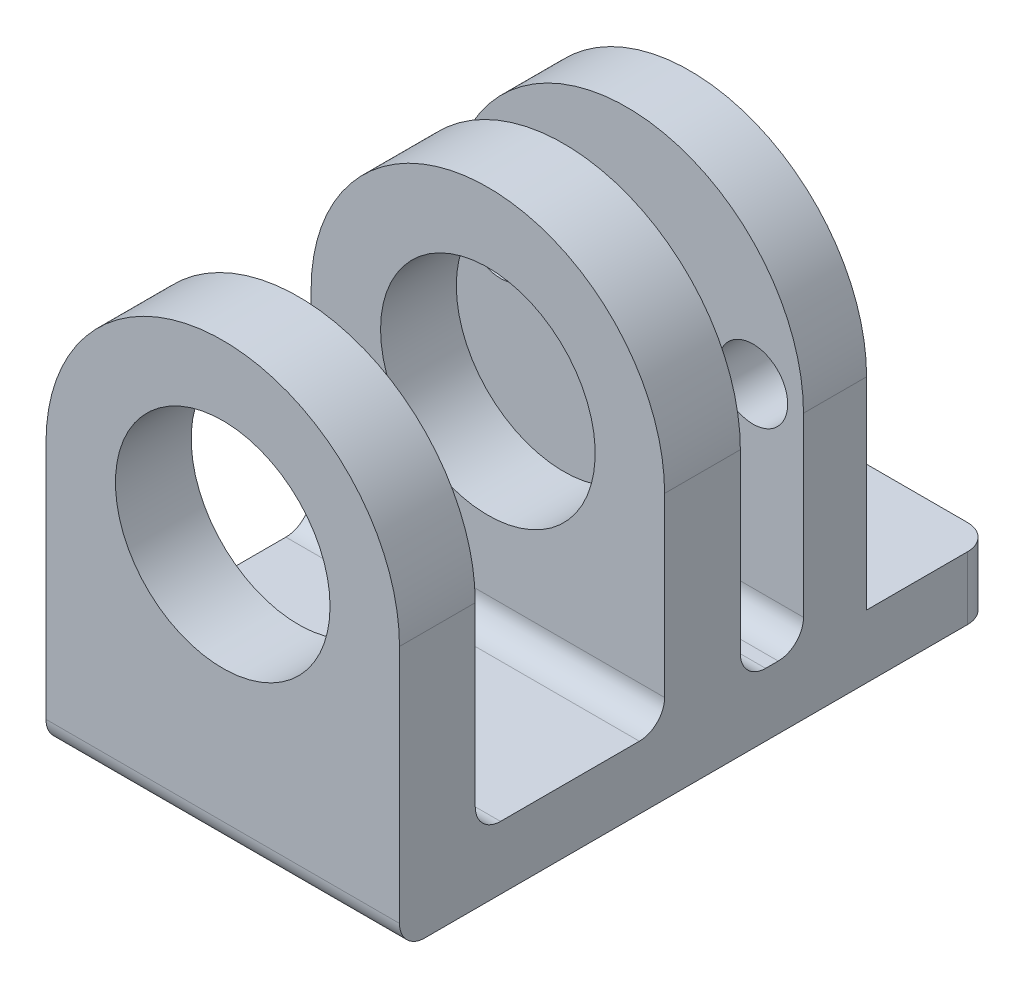
ISO-10303-21;
HEADER;
FILE_DESCRIPTION(('STEP AP214'),'2;1');
FILE_NAME('part.step','',(''),(''),'','','');
FILE_SCHEMA(('AUTOMOTIVE_DESIGN { 1 0 10303 214 1 1 1 1 }'));
ENDSEC;
DATA;
#1=APPLICATION_CONTEXT('core data for automotive mechanical design processes');
#2=APPLICATION_PROTOCOL_DEFINITION('international standard','automotive_design',2000,#1);
#3=PRODUCT_CONTEXT('',#1,'mechanical');
#4=PRODUCT('Part','Part','',(#3));
#5=PRODUCT_RELATED_PRODUCT_CATEGORY('part','',(#4));
#6=PRODUCT_DEFINITION_FORMATION('','',#4);
#7=PRODUCT_DEFINITION_CONTEXT('part definition',#1,'design');
#8=PRODUCT_DEFINITION('design','',#6,#7);
#9=PRODUCT_DEFINITION_SHAPE('','',#8);
#10=(LENGTH_UNIT() NAMED_UNIT(*) SI_UNIT(.MILLI.,.METRE.));
#11=(NAMED_UNIT(*) PLANE_ANGLE_UNIT() SI_UNIT($,.RADIAN.));
#12=(NAMED_UNIT(*) SI_UNIT($,.STERADIAN.) SOLID_ANGLE_UNIT());
#13=UNCERTAINTY_MEASURE_WITH_UNIT(LENGTH_MEASURE(1.E-05),#10,'distance_accuracy_value','');
#14=(GEOMETRIC_REPRESENTATION_CONTEXT(3) GLOBAL_UNCERTAINTY_ASSIGNED_CONTEXT((#13)) GLOBAL_UNIT_ASSIGNED_CONTEXT((#10,
#11,#12)) REPRESENTATION_CONTEXT('',''));
#15=CARTESIAN_POINT('',(0.,0.,0.));
#16=DIRECTION('',(0.,0.,1.));
#17=DIRECTION('',(1.,0.,0.));
#18=AXIS2_PLACEMENT_3D('',#15,#16,#17);
#19=CARTESIAN_POINT('',(-14.,-16.,-79.4429253066558));
#20=DIRECTION('',(0.,1.,0.));
#21=DIRECTION('',(0.,0.,1.));
#22=AXIS2_PLACEMENT_3D('',#19,#20,#21);
#23=PLANE('',#22);
#24=DIRECTION('',(0.,0.,1.));
#25=VECTOR('',#24,1.);
#26=CARTESIAN_POINT('',(14.,-16.,-79.4429253066558));
#27=LINE('',#26,#25);
#28=CARTESIAN_POINT('',(14.,-16.,-24.));
#29=VERTEX_POINT('',#28);
#30=CARTESIAN_POINT('',(14.,-16.,-23.));
#31=VERTEX_POINT('',#30);
#32=EDGE_CURVE('E284',#29,#31,#27,.T.);
#33=ORIENTED_EDGE('',*,*,#32,.F.);
#34=DIRECTION('',(-1.,0.,0.));
#35=VECTOR('',#34,1.);
#36=CARTESIAN_POINT('',(-14.,-16.,-24.));
#37=LINE('',#36,#35);
#38=CARTESIAN_POINT('',(-14.,-16.,-24.));
#39=VERTEX_POINT('',#38);
#40=EDGE_CURVE('E367',#29,#39,#37,.T.);
#41=ORIENTED_EDGE('',*,*,#40,.T.);
#42=DIRECTION('',(0.,0.,1.));
#43=VECTOR('',#42,1.);
#44=CARTESIAN_POINT('',(-14.,-16.,-79.4429253066558));
#45=LINE('',#44,#43);
#46=CARTESIAN_POINT('',(-14.,-16.,-23.));
#47=VERTEX_POINT('',#46);
#48=EDGE_CURVE('E280',#39,#47,#45,.T.);
#49=ORIENTED_EDGE('',*,*,#48,.T.);
#50=DIRECTION('',(-1.,0.,0.));
#51=VECTOR('',#50,1.);
#52=CARTESIAN_POINT('',(14.,-16.,-23.));
#53=LINE('',#52,#51);
#54=EDGE_CURVE('E364',#47,#31,#53,.F.);
#55=ORIENTED_EDGE('',*,*,#54,.T.);
#56=EDGE_LOOP('',(#33,#41,#49,#55));
#57=FACE_BOUND('',#56,.T.);
#58=ADVANCED_FACE('F41',(#57),#23,.T.);
#59=CARTESIAN_POINT('',(14.,-16.,-13.));
#60=VERTEX_POINT('',#59);
#61=CARTESIAN_POINT('',(14.,-16.,-2.));
#62=VERTEX_POINT('',#61);
#63=EDGE_CURVE('E281',#60,#62,#27,.T.);
#64=ORIENTED_EDGE('',*,*,#63,.F.);
#65=DIRECTION('',(-1.,0.,0.));
#66=VECTOR('',#65,1.);
#67=CARTESIAN_POINT('',(-14.,-16.,-13.));
#68=LINE('',#67,#66);
#69=CARTESIAN_POINT('',(-14.,-16.,-13.));
#70=VERTEX_POINT('',#69);
#71=EDGE_CURVE('E381',#60,#70,#68,.T.);
#72=ORIENTED_EDGE('',*,*,#71,.T.);
#73=CARTESIAN_POINT('',(-14.,-16.,-2.));
#74=VERTEX_POINT('',#73);
#75=EDGE_CURVE('E274',#70,#74,#45,.T.);
#76=ORIENTED_EDGE('',*,*,#75,.T.);
#77=DIRECTION('',(1.,0.,0.));
#78=VECTOR('',#77,1.);
#79=CARTESIAN_POINT('',(-14.,-16.,-2.));
#80=LINE('',#79,#78);
#81=EDGE_CURVE('E378',#74,#62,#80,.T.);
#82=ORIENTED_EDGE('',*,*,#81,.T.);
#83=EDGE_LOOP('',(#64,#72,#76,#82));
#84=FACE_BOUND('',#83,.T.);
#85=ADVANCED_FACE('F423',(#84),#23,.T.);
#86=CARTESIAN_POINT('',(0.,0.,6.));
#87=DIRECTION('',(0.,0.,-1.));
#88=DIRECTION('',(-1.,0.,0.));
#89=AXIS2_PLACEMENT_3D('',#86,#87,#88);
#90=CYLINDRICAL_SURFACE('',#89,14.);
#91=CARTESIAN_POINT('',(0.,0.,0.));
#92=DIRECTION('',(0.,0.,1.));
#93=DIRECTION('',(1.,0.,0.));
#94=AXIS2_PLACEMENT_3D('',#91,#92,#93);
#95=CIRCLE('',#94,14.);
#96=CARTESIAN_POINT('',(14.,0.,0.));
#97=VERTEX_POINT('',#96);
#98=CARTESIAN_POINT('',(-14.,0.,0.));
#99=VERTEX_POINT('',#98);
#100=EDGE_CURVE('E312',#97,#99,#95,.T.);
#101=ORIENTED_EDGE('',*,*,#100,.T.);
#102=DIRECTION('',(0.,0.,-1.));
#103=VECTOR('',#102,1.);
#104=CARTESIAN_POINT('',(-14.,0.,6.));
#105=LINE('',#104,#103);
#106=CARTESIAN_POINT('',(-14.,0.,6.));
#107=VERTEX_POINT('',#106);
#108=EDGE_CURVE('E325',#107,#99,#105,.T.);
#109=ORIENTED_EDGE('',*,*,#108,.F.);
#110=CARTESIAN_POINT('',(0.,0.,6.));
#111=DIRECTION('',(0.,0.,1.));
#112=DIRECTION('',(1.,0.,0.));
#113=AXIS2_PLACEMENT_3D('',#110,#111,#112);
#114=CIRCLE('',#113,14.);
#115=CARTESIAN_POINT('',(14.,0.,6.));
#116=VERTEX_POINT('',#115);
#117=EDGE_CURVE('E296',#116,#107,#114,.T.);
#118=ORIENTED_EDGE('',*,*,#117,.F.);
#119=DIRECTION('',(0.,0.,-1.));
#120=VECTOR('',#119,1.);
#121=CARTESIAN_POINT('',(14.,0.,6.));
#122=LINE('',#121,#120);
#123=EDGE_CURVE('E308',#116,#97,#122,.T.);
#124=ORIENTED_EDGE('',*,*,#123,.T.);
#125=EDGE_LOOP('',(#101,#109,#118,#124));
#126=FACE_BOUND('',#125,.T.);
#127=ADVANCED_FACE('F473',(#126),#90,.T.);
#128=CARTESIAN_POINT('',(-14.,0.,6.));
#129=DIRECTION('',(1.,0.,0.));
#130=DIRECTION('',(0.,0.,-1.));
#131=AXIS2_PLACEMENT_3D('',#128,#129,#130);
#132=PLANE('',#131);
#133=CARTESIAN_POINT('',(-14.,-16.,-39.));
#134=VERTEX_POINT('',#133);
#135=CARTESIAN_POINT('',(-14.,-16.,-31.));
#136=VERTEX_POINT('',#135);
#137=EDGE_CURVE('E276',#134,#136,#45,.T.);
#138=ORIENTED_EDGE('',*,*,#137,.F.);
#139=DIRECTION('',(0.,-1.,0.));
#140=VECTOR('',#139,1.);
#141=CARTESIAN_POINT('',(-14.,-21.,-39.));
#142=LINE('',#141,#140);
#143=CARTESIAN_POINT('',(-14.,-21.,-39.));
#144=VERTEX_POINT('',#143);
#145=EDGE_CURVE('E332',#134,#144,#142,.T.);
#146=ORIENTED_EDGE('',*,*,#145,.T.);
#147=DIRECTION('',(0.,0.,1.));
#148=VECTOR('',#147,1.);
#149=CARTESIAN_POINT('',(-14.,-21.,-79.4429253066558));
#150=LINE('',#149,#148);
#151=CARTESIAN_POINT('',(-14.,-21.,4.));
#152=VERTEX_POINT('',#151);
#153=EDGE_CURVE('E279',#144,#152,#150,.T.);
#154=ORIENTED_EDGE('',*,*,#153,.T.);
#155=CARTESIAN_POINT('',(-14.,-19.,4.));
#156=DIRECTION('',(1.,0.,0.));
#157=DIRECTION('',(0.,0.,-1.));
#158=AXIS2_PLACEMENT_3D('',#155,#156,#157);
#159=CIRCLE('',#158,2.);
#160=CARTESIAN_POINT('',(-14.,-19.,6.));
#161=VERTEX_POINT('',#160);
#162=EDGE_CURVE('E329',#152,#161,#159,.F.);
#163=ORIENTED_EDGE('',*,*,#162,.T.);
#164=DIRECTION('',(0.,-1.,0.));
#165=VECTOR('',#164,1.);
#166=CARTESIAN_POINT('',(-14.,0.,6.));
#167=LINE('',#166,#165);
#168=EDGE_CURVE('E301',#107,#161,#167,.T.);
#169=ORIENTED_EDGE('',*,*,#168,.F.);
#170=ORIENTED_EDGE('',*,*,#108,.T.);
#171=DIRECTION('',(0.,-1.,0.));
#172=VECTOR('',#171,1.);
#173=CARTESIAN_POINT('',(-14.,0.,0.));
#174=LINE('',#173,#172);
#175=CARTESIAN_POINT('',(-14.,-14.,0.));
#176=VERTEX_POINT('',#175);
#177=EDGE_CURVE('E316',#99,#176,#174,.T.);
#178=ORIENTED_EDGE('',*,*,#177,.T.);
#179=CARTESIAN_POINT('',(-14.,-14.,-2.));
#180=DIRECTION('',(1.,0.,0.));
#181=DIRECTION('',(0.,0.,-1.));
#182=AXIS2_PLACEMENT_3D('',#179,#180,#181);
#183=CIRCLE('',#182,2.);
#184=EDGE_CURVE('E11',#176,#74,#183,.T.);
#185=ORIENTED_EDGE('',*,*,#184,.T.);
#186=ORIENTED_EDGE('',*,*,#75,.F.);
#187=CARTESIAN_POINT('',(-14.,-14.,-13.));
#188=DIRECTION('',(1.,0.,0.));
#189=DIRECTION('',(0.,0.,-1.));
#190=AXIS2_PLACEMENT_3D('',#187,#188,#189);
#191=CIRCLE('',#190,2.);
#192=CARTESIAN_POINT('',(-14.,-14.,-15.));
#193=VERTEX_POINT('',#192);
#194=EDGE_CURVE('E407',#70,#193,#191,.T.);
#195=ORIENTED_EDGE('',*,*,#194,.T.);
#196=DIRECTION('',(0.,1.,0.));
#197=VECTOR('',#196,1.);
#198=CARTESIAN_POINT('',(-14.,0.,-15.));
#199=LINE('',#198,#197);
#200=CARTESIAN_POINT('',(-14.,0.,-15.));
#201=VERTEX_POINT('',#200);
#202=EDGE_CURVE('E235',#193,#201,#199,.T.);
#203=ORIENTED_EDGE('',*,*,#202,.T.);
#204=DIRECTION('',(0.,0.,1.));
#205=VECTOR('',#204,1.);
#206=CARTESIAN_POINT('',(-14.,0.,-21.));
#207=LINE('',#206,#205);
#208=CARTESIAN_POINT('',(-14.,0.,-21.));
#209=VERTEX_POINT('',#208);
#210=EDGE_CURVE('E261',#209,#201,#207,.T.);
#211=ORIENTED_EDGE('',*,*,#210,.F.);
#212=DIRECTION('',(0.,1.,0.));
#213=VECTOR('',#212,1.);
#214=CARTESIAN_POINT('',(-14.,0.,-21.));
#215=LINE('',#214,#213);
#216=CARTESIAN_POINT('',(-14.,-14.,-21.));
#217=VERTEX_POINT('',#216);
#218=EDGE_CURVE('E239',#217,#209,#215,.T.);
#219=ORIENTED_EDGE('',*,*,#218,.F.);
#220=CARTESIAN_POINT('',(-14.,-14.,-23.));
#221=DIRECTION('',(1.,0.,0.));
#222=DIRECTION('',(0.,0.,-1.));
#223=AXIS2_PLACEMENT_3D('',#220,#221,#222);
#224=CIRCLE('',#223,2.);
#225=EDGE_CURVE('E401',#217,#47,#224,.T.);
#226=ORIENTED_EDGE('',*,*,#225,.T.);
#227=ORIENTED_EDGE('',*,*,#48,.F.);
#228=CARTESIAN_POINT('',(-14.,-14.,-24.));
#229=DIRECTION('',(1.,0.,0.));
#230=DIRECTION('',(0.,0.,-1.));
#231=AXIS2_PLACEMENT_3D('',#228,#229,#230);
#232=CIRCLE('',#231,2.);
#233=CARTESIAN_POINT('',(-14.,-14.,-26.));
#234=VERTEX_POINT('',#233);
#235=EDGE_CURVE('E395',#39,#234,#232,.T.);
#236=ORIENTED_EDGE('',*,*,#235,.T.);
#237=DIRECTION('',(0.,1.,0.));
#238=VECTOR('',#237,1.);
#239=CARTESIAN_POINT('',(-14.,-16.,-26.));
#240=LINE('',#239,#238);
#241=CARTESIAN_POINT('',(-14.,0.,-26.));
#242=VERTEX_POINT('',#241);
#243=EDGE_CURVE('E204',#234,#242,#240,.T.);
#244=ORIENTED_EDGE('',*,*,#243,.T.);
#245=DIRECTION('',(0.,0.,1.));
#246=VECTOR('',#245,1.);
#247=CARTESIAN_POINT('',(-14.,0.,-31.));
#248=LINE('',#247,#246);
#249=CARTESIAN_POINT('',(-14.,0.,-31.));
#250=VERTEX_POINT('',#249);
#251=EDGE_CURVE('E201',#250,#242,#248,.T.);
#252=ORIENTED_EDGE('',*,*,#251,.F.);
#253=DIRECTION('',(0.,1.,0.));
#254=VECTOR('',#253,1.);
#255=CARTESIAN_POINT('',(-14.,-16.,-31.));
#256=LINE('',#255,#254);
#257=EDGE_CURVE('E186',#136,#250,#256,.T.);
#258=ORIENTED_EDGE('',*,*,#257,.F.);
#259=EDGE_LOOP('',(#138,#146,#154,#163,#169,#170,#178,#185,#186,#195,#203,#211,#219,#226,#227,
#236,#244,#252,#258));
#260=FACE_BOUND('',#259,.T.);
#261=ADVANCED_FACE('F202',(#260),#132,.F.);
#262=CARTESIAN_POINT('',(0.,0.,6.));
#263=DIRECTION('',(0.,0.,-1.));
#264=DIRECTION('',(-1.,0.,0.));
#265=AXIS2_PLACEMENT_3D('',#262,#263,#264);
#266=CYLINDRICAL_SURFACE('',#265,8.5);
#267=CARTESIAN_POINT('',(0.,0.,6.));
#268=DIRECTION('',(0.,0.,1.));
#269=DIRECTION('',(1.,0.,0.));
#270=AXIS2_PLACEMENT_3D('',#267,#268,#269);
#271=CIRCLE('',#270,8.5);
#272=CARTESIAN_POINT('',(8.5,0.,6.));
#273=VERTEX_POINT('',#272);
#274=EDGE_CURVE('E292',#273,#273,#271,.T.);
#275=ORIENTED_EDGE('',*,*,#274,.T.);
#276=EDGE_LOOP('',(#275));
#277=FACE_BOUND('',#276,.T.);
#278=CARTESIAN_POINT('',(0.,0.,0.));
#279=DIRECTION('',(0.,0.,1.));
#280=DIRECTION('',(1.,0.,0.));
#281=AXIS2_PLACEMENT_3D('',#278,#279,#280);
#282=CIRCLE('',#281,8.5);
#283=CARTESIAN_POINT('',(8.5,0.,0.));
#284=VERTEX_POINT('',#283);
#285=EDGE_CURVE('E291',#284,#284,#282,.T.);
#286=ORIENTED_EDGE('',*,*,#285,.F.);
#287=EDGE_LOOP('',(#286));
#288=FACE_BOUND('',#287,.T.);
#289=ADVANCED_FACE('F523',(#277,#288),#266,.F.);
#290=CARTESIAN_POINT('',(14.,0.,6.));
#291=DIRECTION('',(-1.,0.,0.));
#292=DIRECTION('',(0.,0.,1.));
#293=AXIS2_PLACEMENT_3D('',#290,#291,#292);
#294=PLANE('',#293);
#295=DIRECTION('',(0.,0.,1.));
#296=VECTOR('',#295,1.);
#297=CARTESIAN_POINT('',(14.,-21.,-79.4429253066558));
#298=LINE('',#297,#296);
#299=CARTESIAN_POINT('',(14.,-21.,-39.));
#300=VERTEX_POINT('',#299);
#301=CARTESIAN_POINT('',(14.,-21.,4.));
#302=VERTEX_POINT('',#301);
#303=EDGE_CURVE('E269',#300,#302,#298,.T.);
#304=ORIENTED_EDGE('',*,*,#303,.F.);
#305=DIRECTION('',(0.,1.,0.));
#306=VECTOR('',#305,1.);
#307=CARTESIAN_POINT('',(14.,-16.,-39.));
#308=LINE('',#307,#306);
#309=CARTESIAN_POINT('',(14.,-16.,-39.));
#310=VERTEX_POINT('',#309);
#311=EDGE_CURVE('E360',#300,#310,#308,.T.);
#312=ORIENTED_EDGE('',*,*,#311,.T.);
#313=CARTESIAN_POINT('',(14.,-16.,-31.));
#314=VERTEX_POINT('',#313);
#315=EDGE_CURVE('E275',#310,#314,#27,.T.);
#316=ORIENTED_EDGE('',*,*,#315,.T.);
#317=DIRECTION('',(0.,-1.,0.));
#318=VECTOR('',#317,1.);
#319=CARTESIAN_POINT('',(14.,0.,-31.));
#320=LINE('',#319,#318);
#321=CARTESIAN_POINT('',(14.,0.,-31.));
#322=VERTEX_POINT('',#321);
#323=EDGE_CURVE('E229',#322,#314,#320,.T.);
#324=ORIENTED_EDGE('',*,*,#323,.F.);
#325=DIRECTION('',(0.,0.,1.));
#326=VECTOR('',#325,1.);
#327=CARTESIAN_POINT('',(14.,0.,-31.));
#328=LINE('',#327,#326);
#329=CARTESIAN_POINT('',(14.,0.,-26.));
#330=VERTEX_POINT('',#329);
#331=EDGE_CURVE('E209',#322,#330,#328,.T.);
#332=ORIENTED_EDGE('',*,*,#331,.T.);
#333=DIRECTION('',(0.,-1.,0.));
#334=VECTOR('',#333,1.);
#335=CARTESIAN_POINT('',(14.,0.,-26.));
#336=LINE('',#335,#334);
#337=CARTESIAN_POINT('',(14.,-14.,-26.));
#338=VERTEX_POINT('',#337);
#339=EDGE_CURVE('E220',#330,#338,#336,.T.);
#340=ORIENTED_EDGE('',*,*,#339,.T.);
#341=CARTESIAN_POINT('',(14.,-14.,-24.));
#342=DIRECTION('',(-1.,0.,0.));
#343=DIRECTION('',(0.,0.,1.));
#344=AXIS2_PLACEMENT_3D('',#341,#342,#343);
#345=CIRCLE('',#344,2.);
#346=EDGE_CURVE('E398',#338,#29,#345,.T.);
#347=ORIENTED_EDGE('',*,*,#346,.T.);
#348=ORIENTED_EDGE('',*,*,#32,.T.);
#349=CARTESIAN_POINT('',(14.,-14.,-23.));
#350=DIRECTION('',(-1.,0.,0.));
#351=DIRECTION('',(0.,0.,1.));
#352=AXIS2_PLACEMENT_3D('',#349,#350,#351);
#353=CIRCLE('',#352,2.);
#354=CARTESIAN_POINT('',(14.,-14.,-21.));
#355=VERTEX_POINT('',#354);
#356=EDGE_CURVE('E404',#31,#355,#353,.T.);
#357=ORIENTED_EDGE('',*,*,#356,.T.);
#358=DIRECTION('',(0.,-1.,0.));
#359=VECTOR('',#358,1.);
#360=CARTESIAN_POINT('',(14.,-16.,-21.));
#361=LINE('',#360,#359);
#362=CARTESIAN_POINT('',(14.,0.,-21.));
#363=VERTEX_POINT('',#362);
#364=EDGE_CURVE('E246',#363,#355,#361,.T.);
#365=ORIENTED_EDGE('',*,*,#364,.F.);
#366=DIRECTION('',(0.,0.,1.));
#367=VECTOR('',#366,1.);
#368=CARTESIAN_POINT('',(14.,0.,-21.));
#369=LINE('',#368,#367);
#370=CARTESIAN_POINT('',(14.,0.,-15.));
#371=VERTEX_POINT('',#370);
#372=EDGE_CURVE('E250',#363,#371,#369,.T.);
#373=ORIENTED_EDGE('',*,*,#372,.T.);
#374=DIRECTION('',(0.,-1.,0.));
#375=VECTOR('',#374,1.);
#376=CARTESIAN_POINT('',(14.,-16.,-15.));
#377=LINE('',#376,#375);
#378=CARTESIAN_POINT('',(14.,-14.,-15.));
#379=VERTEX_POINT('',#378);
#380=EDGE_CURVE('E243',#371,#379,#377,.T.);
#381=ORIENTED_EDGE('',*,*,#380,.T.);
#382=CARTESIAN_POINT('',(14.,-14.,-13.));
#383=DIRECTION('',(-1.,0.,0.));
#384=DIRECTION('',(0.,0.,1.));
#385=AXIS2_PLACEMENT_3D('',#382,#383,#384);
#386=CIRCLE('',#385,2.);
#387=EDGE_CURVE('E64',#379,#60,#386,.T.);
#388=ORIENTED_EDGE('',*,*,#387,.T.);
#389=ORIENTED_EDGE('',*,*,#63,.T.);
#390=CARTESIAN_POINT('',(14.,-14.,-2.));
#391=DIRECTION('',(-1.,0.,0.));
#392=DIRECTION('',(0.,0.,1.));
#393=AXIS2_PLACEMENT_3D('',#390,#391,#392);
#394=CIRCLE('',#393,2.);
#395=CARTESIAN_POINT('',(14.,-14.,0.));
#396=VERTEX_POINT('',#395);
#397=EDGE_CURVE('E50',#62,#396,#394,.T.);
#398=ORIENTED_EDGE('',*,*,#397,.T.);
#399=DIRECTION('',(0.,1.,0.));
#400=VECTOR('',#399,1.);
#401=CARTESIAN_POINT('',(14.,0.,0.));
#402=LINE('',#401,#400);
#403=EDGE_CURVE('E297',#396,#97,#402,.T.);
#404=ORIENTED_EDGE('',*,*,#403,.T.);
#405=ORIENTED_EDGE('',*,*,#123,.F.);
#406=DIRECTION('',(0.,1.,0.));
#407=VECTOR('',#406,1.);
#408=CARTESIAN_POINT('',(14.,0.,6.));
#409=LINE('',#408,#407);
#410=CARTESIAN_POINT('',(14.,-19.,6.));
#411=VERTEX_POINT('',#410);
#412=EDGE_CURVE('E305',#411,#116,#409,.T.);
#413=ORIENTED_EDGE('',*,*,#412,.F.);
#414=CARTESIAN_POINT('',(14.,-19.,4.));
#415=DIRECTION('',(-1.,0.,0.));
#416=DIRECTION('',(0.,0.,1.));
#417=AXIS2_PLACEMENT_3D('',#414,#415,#416);
#418=CIRCLE('',#417,2.);
#419=EDGE_CURVE('E357',#411,#302,#418,.F.);
#420=ORIENTED_EDGE('',*,*,#419,.T.);
#421=EDGE_LOOP('',(#304,#312,#316,#324,#332,#340,#347,#348,#357,#365,#373,#381,#388,#389,#398,
#404,#405,#413,#420));
#422=FACE_BOUND('',#421,.T.);
#423=ADVANCED_FACE('F414',(#422),#294,.F.);
#424=CARTESIAN_POINT('',(0.,0.,6.));
#425=DIRECTION('',(0.,0.,1.));
#426=DIRECTION('',(1.,0.,0.));
#427=AXIS2_PLACEMENT_3D('',#424,#425,#426);
#428=PLANE('',#427);
#429=ORIENTED_EDGE('',*,*,#274,.F.);
#430=EDGE_LOOP('',(#429));
#431=FACE_BOUND('',#430,.T.);
#432=ORIENTED_EDGE('',*,*,#168,.T.);
#433=DIRECTION('',(1.,0.,0.));
#434=VECTOR('',#433,1.);
#435=CARTESIAN_POINT('',(0.,-19.,6.));
#436=LINE('',#435,#434);
#437=EDGE_CURVE('E388',#161,#411,#436,.T.);
#438=ORIENTED_EDGE('',*,*,#437,.T.);
#439=ORIENTED_EDGE('',*,*,#412,.T.);
#440=ORIENTED_EDGE('',*,*,#117,.T.);
#441=EDGE_LOOP('',(#432,#438,#439,#440));
#442=FACE_BOUND('',#441,.T.);
#443=ADVANCED_FACE('F501',(#431,#442),#428,.T.);
#444=CARTESIAN_POINT('',(0.,0.,0.));
#445=DIRECTION('',(0.,0.,1.));
#446=DIRECTION('',(1.,0.,0.));
#447=AXIS2_PLACEMENT_3D('',#444,#445,#446);
#448=PLANE('',#447);
#449=ORIENTED_EDGE('',*,*,#285,.T.);
#450=EDGE_LOOP('',(#449));
#451=FACE_BOUND('',#450,.T.);
#452=ORIENTED_EDGE('',*,*,#403,.F.);
#453=DIRECTION('',(1.,0.,0.));
#454=VECTOR('',#453,1.);
#455=CARTESIAN_POINT('',(0.,-14.,0.));
#456=LINE('',#455,#454);
#457=EDGE_CURVE('E392',#396,#176,#456,.F.);
#458=ORIENTED_EDGE('',*,*,#457,.T.);
#459=ORIENTED_EDGE('',*,*,#177,.F.);
#460=ORIENTED_EDGE('',*,*,#100,.F.);
#461=EDGE_LOOP('',(#452,#458,#459,#460));
#462=FACE_BOUND('',#461,.T.);
#463=ADVANCED_FACE('F418',(#451,#462),#448,.F.);
#464=CARTESIAN_POINT('',(0.,0.,-41.));
#465=DIRECTION('',(0.,0.,-1.));
#466=DIRECTION('',(-1.,0.,0.));
#467=AXIS2_PLACEMENT_3D('',#464,#465,#466);
#468=PLANE('',#467);
#469=DIRECTION('',(1.,0.,0.));
#470=VECTOR('',#469,1.);
#471=CARTESIAN_POINT('',(-14.,-21.,-41.));
#472=LINE('',#471,#470);
#473=CARTESIAN_POINT('',(-12.,-21.,-41.));
#474=VERTEX_POINT('',#473);
#475=CARTESIAN_POINT('',(12.,-21.,-41.));
#476=VERTEX_POINT('',#475);
#477=EDGE_CURVE('E265',#474,#476,#472,.T.);
#478=ORIENTED_EDGE('',*,*,#477,.F.);
#479=DIRECTION('',(0.,-1.,0.));
#480=VECTOR('',#479,1.);
#481=CARTESIAN_POINT('',(-12.,-16.,-41.));
#482=LINE('',#481,#480);
#483=CARTESIAN_POINT('',(-12.,-16.,-41.));
#484=VERTEX_POINT('',#483);
#485=EDGE_CURVE('E348',#474,#484,#482,.F.);
#486=ORIENTED_EDGE('',*,*,#485,.T.);
#487=DIRECTION('',(-1.,0.,0.));
#488=VECTOR('',#487,1.);
#489=CARTESIAN_POINT('',(-14.,-16.,-41.));
#490=LINE('',#489,#488);
#491=CARTESIAN_POINT('',(12.,-16.,-41.));
#492=VERTEX_POINT('',#491);
#493=EDGE_CURVE('E270',#492,#484,#490,.T.);
#494=ORIENTED_EDGE('',*,*,#493,.F.);
#495=DIRECTION('',(0.,1.,0.));
#496=VECTOR('',#495,1.);
#497=CARTESIAN_POINT('',(12.,-21.,-41.));
#498=LINE('',#497,#496);
#499=EDGE_CURVE('E345',#492,#476,#498,.F.);
#500=ORIENTED_EDGE('',*,*,#499,.T.);
#501=EDGE_LOOP('',(#478,#486,#494,#500));
#502=FACE_BOUND('',#501,.T.);
#503=ADVANCED_FACE('F484',(#502),#468,.T.);
#504=CARTESIAN_POINT('',(-14.,-21.,-79.4429253066558));
#505=DIRECTION('',(0.,-1.,0.));
#506=DIRECTION('',(1.,0.,0.));
#507=AXIS2_PLACEMENT_3D('',#504,#505,#506);
#508=PLANE('',#507);
#509=ORIENTED_EDGE('',*,*,#153,.F.);
#510=CARTESIAN_POINT('',(-12.,-21.,-39.));
#511=DIRECTION('',(0.,-1.,0.));
#512=DIRECTION('',(1.,0.,0.));
#513=AXIS2_PLACEMENT_3D('',#510,#511,#512);
#514=CIRCLE('',#513,2.);
#515=EDGE_CURVE('E342',#144,#474,#514,.T.);
#516=ORIENTED_EDGE('',*,*,#515,.T.);
#517=ORIENTED_EDGE('',*,*,#477,.T.);
#518=CARTESIAN_POINT('',(12.,-21.,-39.));
#519=DIRECTION('',(0.,-1.,0.));
#520=DIRECTION('',(1.,0.,0.));
#521=AXIS2_PLACEMENT_3D('',#518,#519,#520);
#522=CIRCLE('',#521,2.);
#523=EDGE_CURVE('E339',#476,#300,#522,.T.);
#524=ORIENTED_EDGE('',*,*,#523,.T.);
#525=ORIENTED_EDGE('',*,*,#303,.T.);
#526=DIRECTION('',(1.,0.,0.));
#527=VECTOR('',#526,1.);
#528=CARTESIAN_POINT('',(-14.,-21.,4.));
#529=LINE('',#528,#527);
#530=EDGE_CURVE('E336',#302,#152,#529,.F.);
#531=ORIENTED_EDGE('',*,*,#530,.T.);
#532=EDGE_LOOP('',(#509,#516,#517,#524,#525,#531));
#533=FACE_BOUND('',#532,.T.);
#534=ADVANCED_FACE('F477',(#533),#508,.T.);
#535=ORIENTED_EDGE('',*,*,#493,.T.);
#536=CARTESIAN_POINT('',(-12.,-16.,-39.));
#537=DIRECTION('',(0.,1.,0.));
#538=DIRECTION('',(0.,0.,1.));
#539=AXIS2_PLACEMENT_3D('',#536,#537,#538);
#540=CIRCLE('',#539,2.);
#541=EDGE_CURVE('E354',#484,#134,#540,.T.);
#542=ORIENTED_EDGE('',*,*,#541,.T.);
#543=ORIENTED_EDGE('',*,*,#137,.T.);
#544=DIRECTION('',(-1.,0.,0.));
#545=VECTOR('',#544,1.);
#546=CARTESIAN_POINT('',(14.,-16.,-31.));
#547=LINE('',#546,#545);
#548=EDGE_CURVE('E195',#314,#136,#547,.T.);
#549=ORIENTED_EDGE('',*,*,#548,.F.);
#550=ORIENTED_EDGE('',*,*,#315,.F.);
#551=CARTESIAN_POINT('',(12.,-16.,-39.));
#552=DIRECTION('',(0.,1.,0.));
#553=DIRECTION('',(0.,0.,1.));
#554=AXIS2_PLACEMENT_3D('',#551,#552,#553);
#555=CIRCLE('',#554,2.);
#556=EDGE_CURVE('E351',#310,#492,#555,.T.);
#557=ORIENTED_EDGE('',*,*,#556,.T.);
#558=EDGE_LOOP('',(#535,#542,#543,#549,#550,#557));
#559=FACE_BOUND('',#558,.T.);
#560=ADVANCED_FACE('F469',(#559),#23,.T.);
#561=CARTESIAN_POINT('',(0.,0.,-21.));
#562=DIRECTION('',(0.,0.,-1.));
#563=DIRECTION('',(-1.,0.,0.));
#564=AXIS2_PLACEMENT_3D('',#561,#562,#563);
#565=PLANE('',#564);
#566=ORIENTED_EDGE('',*,*,#364,.T.);
#567=DIRECTION('',(-1.,0.,0.));
#568=VECTOR('',#567,1.);
#569=CARTESIAN_POINT('',(-14.,-14.,-21.));
#570=LINE('',#569,#568);
#571=EDGE_CURVE('E374',#355,#217,#570,.T.);
#572=ORIENTED_EDGE('',*,*,#571,.T.);
#573=ORIENTED_EDGE('',*,*,#218,.T.);
#574=CARTESIAN_POINT('',(0.,0.,-21.));
#575=DIRECTION('',(0.,0.,-1.));
#576=DIRECTION('',(-1.,0.,0.));
#577=AXIS2_PLACEMENT_3D('',#574,#575,#576);
#578=CIRCLE('',#577,14.);
#579=EDGE_CURVE('E242',#209,#363,#578,.T.);
#580=ORIENTED_EDGE('',*,*,#579,.T.);
#581=EDGE_LOOP('',(#566,#572,#573,#580));
#582=FACE_BOUND('',#581,.T.);
#583=CARTESIAN_POINT('',(0.,0.,-21.));
#584=DIRECTION('',(0.,0.,-1.));
#585=DIRECTION('',(-1.,0.,0.));
#586=AXIS2_PLACEMENT_3D('',#583,#584,#585);
#587=CIRCLE('',#586,8.5);
#588=CARTESIAN_POINT('',(-8.5,0.,-21.));
#589=VERTEX_POINT('',#588);
#590=EDGE_CURVE('E231',#589,#589,#587,.T.);
#591=ORIENTED_EDGE('',*,*,#590,.F.);
#592=EDGE_LOOP('',(#591));
#593=FACE_BOUND('',#592,.T.);
#594=ADVANCED_FACE('F440',(#582,#593),#565,.T.);
#595=CARTESIAN_POINT('',(0.,0.,-15.));
#596=DIRECTION('',(0.,0.,-1.));
#597=DIRECTION('',(-1.,0.,0.));
#598=AXIS2_PLACEMENT_3D('',#595,#596,#597);
#599=PLANE('',#598);
#600=ORIENTED_EDGE('',*,*,#202,.F.);
#601=DIRECTION('',(-1.,0.,0.));
#602=VECTOR('',#601,1.);
#603=CARTESIAN_POINT('',(0.,-14.,-15.));
#604=LINE('',#603,#602);
#605=EDGE_CURVE('E385',#193,#379,#604,.F.);
#606=ORIENTED_EDGE('',*,*,#605,.T.);
#607=ORIENTED_EDGE('',*,*,#380,.F.);
#608=CARTESIAN_POINT('',(0.,0.,-15.));
#609=DIRECTION('',(0.,0.,-1.));
#610=DIRECTION('',(-1.,0.,0.));
#611=AXIS2_PLACEMENT_3D('',#608,#609,#610);
#612=CIRCLE('',#611,14.);
#613=EDGE_CURVE('E253',#201,#371,#612,.T.);
#614=ORIENTED_EDGE('',*,*,#613,.F.);
#615=EDGE_LOOP('',(#600,#606,#607,#614));
#616=FACE_BOUND('',#615,.T.);
#617=CARTESIAN_POINT('',(0.,0.,-15.));
#618=DIRECTION('',(0.,0.,-1.));
#619=DIRECTION('',(-1.,0.,0.));
#620=AXIS2_PLACEMENT_3D('',#617,#618,#619);
#621=CIRCLE('',#620,8.5);
#622=CARTESIAN_POINT('',(-8.5,0.,-15.));
#623=VERTEX_POINT('',#622);
#624=EDGE_CURVE('E208',#623,#623,#621,.T.);
#625=ORIENTED_EDGE('',*,*,#624,.T.);
#626=EDGE_LOOP('',(#625));
#627=FACE_BOUND('',#626,.T.);
#628=ADVANCED_FACE('F452',(#616,#627),#599,.F.);
#629=CARTESIAN_POINT('',(0.,0.,-21.));
#630=DIRECTION('',(0.,0.,1.));
#631=DIRECTION('',(1.,0.,0.));
#632=AXIS2_PLACEMENT_3D('',#629,#630,#631);
#633=CYLINDRICAL_SURFACE('',#632,14.);
#634=ORIENTED_EDGE('',*,*,#613,.T.);
#635=ORIENTED_EDGE('',*,*,#372,.F.);
#636=ORIENTED_EDGE('',*,*,#579,.F.);
#637=ORIENTED_EDGE('',*,*,#210,.T.);
#638=EDGE_LOOP('',(#634,#635,#636,#637));
#639=FACE_BOUND('',#638,.T.);
#640=ADVANCED_FACE('F447',(#639),#633,.T.);
#641=CARTESIAN_POINT('',(0.,0.,-21.));
#642=DIRECTION('',(0.,0.,1.));
#643=DIRECTION('',(1.,0.,0.));
#644=AXIS2_PLACEMENT_3D('',#641,#642,#643);
#645=CYLINDRICAL_SURFACE('',#644,8.5);
#646=ORIENTED_EDGE('',*,*,#590,.T.);
#647=EDGE_LOOP('',(#646));
#648=FACE_BOUND('',#647,.T.);
#649=ORIENTED_EDGE('',*,*,#624,.F.);
#650=EDGE_LOOP('',(#649));
#651=FACE_BOUND('',#650,.T.);
#652=ADVANCED_FACE('F577',(#648,#651),#645,.F.);
#653=CARTESIAN_POINT('',(0.,0.,-31.));
#654=DIRECTION('',(0.,0.,-1.));
#655=DIRECTION('',(-1.,0.,0.));
#656=AXIS2_PLACEMENT_3D('',#653,#654,#655);
#657=PLANE('',#656);
#658=CARTESIAN_POINT('',(10.,0.,-31.));
#659=DIRECTION('',(0.,0.,-1.));
#660=DIRECTION('',(-1.,0.,0.));
#661=AXIS2_PLACEMENT_3D('',#658,#659,#660);
#662=CIRCLE('',#661,2.75);
#663=CARTESIAN_POINT('',(7.25,0.,-31.));
#664=VERTEX_POINT('',#663);
#665=EDGE_CURVE('E553',#664,#664,#662,.T.);
#666=ORIENTED_EDGE('',*,*,#665,.F.);
#667=EDGE_LOOP('',(#666));
#668=FACE_BOUND('',#667,.T.);
#669=ORIENTED_EDGE('',*,*,#323,.T.);
#670=ORIENTED_EDGE('',*,*,#548,.T.);
#671=ORIENTED_EDGE('',*,*,#257,.T.);
#672=CARTESIAN_POINT('',(0.,0.,-31.));
#673=DIRECTION('',(0.,0.,-1.));
#674=DIRECTION('',(-1.,0.,0.));
#675=AXIS2_PLACEMENT_3D('',#672,#673,#674);
#676=CIRCLE('',#675,14.);
#677=EDGE_CURVE('E192',#250,#322,#676,.T.);
#678=ORIENTED_EDGE('',*,*,#677,.T.);
#679=EDGE_LOOP('',(#669,#670,#671,#678));
#680=FACE_BOUND('',#679,.T.);
#681=CARTESIAN_POINT('',(0.,0.,-31.));
#682=DIRECTION('',(0.,0.,-1.));
#683=DIRECTION('',(-1.,0.,0.));
#684=AXIS2_PLACEMENT_3D('',#681,#682,#683);
#685=CIRCLE('',#684,5.);
#686=CARTESIAN_POINT('',(-5.,0.,-31.));
#687=VERTEX_POINT('',#686);
#688=EDGE_CURVE('E224',#687,#687,#685,.T.);
#689=ORIENTED_EDGE('',*,*,#688,.F.);
#690=EDGE_LOOP('',(#689));
#691=FACE_BOUND('',#690,.T.);
#692=CARTESIAN_POINT('',(-10.,0.,-31.));
#693=DIRECTION('',(0.,0.,-1.));
#694=DIRECTION('',(-1.,0.,0.));
#695=AXIS2_PLACEMENT_3D('',#692,#693,#694);
#696=CIRCLE('',#695,2.75);
#697=CARTESIAN_POINT('',(-12.75,0.,-31.));
#698=VERTEX_POINT('',#697);
#699=EDGE_CURVE('E561',#698,#698,#696,.T.);
#700=ORIENTED_EDGE('',*,*,#699,.F.);
#701=EDGE_LOOP('',(#700));
#702=FACE_BOUND('',#701,.T.);
#703=ADVANCED_FACE('F189',(#668,#680,#691,#702),#657,.T.);
#704=CARTESIAN_POINT('',(0.,0.,-26.));
#705=DIRECTION('',(0.,0.,-1.));
#706=DIRECTION('',(-1.,0.,0.));
#707=AXIS2_PLACEMENT_3D('',#704,#705,#706);
#708=PLANE('',#707);
#709=ORIENTED_EDGE('',*,*,#243,.F.);
#710=DIRECTION('',(-1.,0.,0.));
#711=VECTOR('',#710,1.);
#712=CARTESIAN_POINT('',(0.,-14.,-26.));
#713=LINE('',#712,#711);
#714=EDGE_CURVE('E371',#234,#338,#713,.F.);
#715=ORIENTED_EDGE('',*,*,#714,.T.);
#716=ORIENTED_EDGE('',*,*,#339,.F.);
#717=CARTESIAN_POINT('',(0.,0.,-26.));
#718=DIRECTION('',(0.,0.,-1.));
#719=DIRECTION('',(-1.,0.,0.));
#720=AXIS2_PLACEMENT_3D('',#717,#718,#719);
#721=CIRCLE('',#720,14.);
#722=EDGE_CURVE('E227',#242,#330,#721,.T.);
#723=ORIENTED_EDGE('',*,*,#722,.F.);
#724=EDGE_LOOP('',(#709,#715,#716,#723));
#725=FACE_BOUND('',#724,.T.);
#726=CARTESIAN_POINT('',(0.,0.,-26.));
#727=DIRECTION('',(0.,0.,-1.));
#728=DIRECTION('',(-1.,0.,0.));
#729=AXIS2_PLACEMENT_3D('',#726,#727,#728);
#730=CIRCLE('',#729,5.);
#731=CARTESIAN_POINT('',(-5.,0.,-26.));
#732=VERTEX_POINT('',#731);
#733=EDGE_CURVE('E549',#732,#732,#730,.T.);
#734=ORIENTED_EDGE('',*,*,#733,.T.);
#735=EDGE_LOOP('',(#734));
#736=FACE_BOUND('',#735,.T.);
#737=CARTESIAN_POINT('',(10.,0.,-26.));
#738=DIRECTION('',(0.,0.,-1.));
#739=DIRECTION('',(-1.,0.,0.));
#740=AXIS2_PLACEMENT_3D('',#737,#738,#739);
#741=CIRCLE('',#740,2.75);
#742=CARTESIAN_POINT('',(7.25,0.,-26.));
#743=VERTEX_POINT('',#742);
#744=EDGE_CURVE('E557',#743,#743,#741,.T.);
#745=ORIENTED_EDGE('',*,*,#744,.T.);
#746=EDGE_LOOP('',(#745));
#747=FACE_BOUND('',#746,.T.);
#748=CARTESIAN_POINT('',(-10.,0.,-26.));
#749=DIRECTION('',(0.,0.,-1.));
#750=DIRECTION('',(-1.,0.,0.));
#751=AXIS2_PLACEMENT_3D('',#748,#749,#750);
#752=CIRCLE('',#751,2.75);
#753=CARTESIAN_POINT('',(-12.75,0.,-26.));
#754=VERTEX_POINT('',#753);
#755=EDGE_CURVE('E565',#754,#754,#752,.T.);
#756=ORIENTED_EDGE('',*,*,#755,.T.);
#757=EDGE_LOOP('',(#756));
#758=FACE_BOUND('',#757,.T.);
#759=ADVANCED_FACE('F576',(#725,#736,#747,#758),#708,.F.);
#760=CARTESIAN_POINT('',(0.,0.,-31.));
#761=DIRECTION('',(0.,0.,1.));
#762=DIRECTION('',(1.,0.,0.));
#763=AXIS2_PLACEMENT_3D('',#760,#761,#762);
#764=CYLINDRICAL_SURFACE('',#763,14.);
#765=ORIENTED_EDGE('',*,*,#722,.T.);
#766=ORIENTED_EDGE('',*,*,#331,.F.);
#767=ORIENTED_EDGE('',*,*,#677,.F.);
#768=ORIENTED_EDGE('',*,*,#251,.T.);
#769=EDGE_LOOP('',(#765,#766,#767,#768));
#770=FACE_BOUND('',#769,.T.);
#771=ADVANCED_FACE('F211',(#770),#764,.T.);
#772=CARTESIAN_POINT('',(0.,0.,-31.));
#773=DIRECTION('',(0.,0.,1.));
#774=DIRECTION('',(1.,0.,0.));
#775=AXIS2_PLACEMENT_3D('',#772,#773,#774);
#776=CYLINDRICAL_SURFACE('',#775,5.);
#777=ORIENTED_EDGE('',*,*,#688,.T.);
#778=EDGE_LOOP('',(#777));
#779=FACE_BOUND('',#778,.T.);
#780=ORIENTED_EDGE('',*,*,#733,.F.);
#781=EDGE_LOOP('',(#780));
#782=FACE_BOUND('',#781,.T.);
#783=ADVANCED_FACE('F590',(#779,#782),#776,.F.);
#784=CARTESIAN_POINT('',(10.,0.,-31.));
#785=DIRECTION('',(0.,0.,1.));
#786=DIRECTION('',(1.,0.,0.));
#787=AXIS2_PLACEMENT_3D('',#784,#785,#786);
#788=CYLINDRICAL_SURFACE('',#787,2.75);
#789=ORIENTED_EDGE('',*,*,#665,.T.);
#790=EDGE_LOOP('',(#789));
#791=FACE_BOUND('',#790,.T.);
#792=ORIENTED_EDGE('',*,*,#744,.F.);
#793=EDGE_LOOP('',(#792));
#794=FACE_BOUND('',#793,.T.);
#795=ADVANCED_FACE('F628',(#791,#794),#788,.F.);
#796=CARTESIAN_POINT('',(-10.,0.,-31.));
#797=DIRECTION('',(0.,0.,1.));
#798=DIRECTION('',(1.,0.,0.));
#799=AXIS2_PLACEMENT_3D('',#796,#797,#798);
#800=CYLINDRICAL_SURFACE('',#799,2.75);
#801=ORIENTED_EDGE('',*,*,#699,.T.);
#802=EDGE_LOOP('',(#801));
#803=FACE_BOUND('',#802,.T.);
#804=ORIENTED_EDGE('',*,*,#755,.F.);
#805=EDGE_LOOP('',(#804));
#806=FACE_BOUND('',#805,.T.);
#807=ADVANCED_FACE('F533',(#803,#806),#800,.F.);
#808=CARTESIAN_POINT('',(-12.,0.,-39.));
#809=DIRECTION('',(0.,1.,0.));
#810=DIRECTION('',(0.,0.,1.));
#811=AXIS2_PLACEMENT_3D('',#808,#809,#810);
#812=CYLINDRICAL_SURFACE('',#811,2.);
#813=ORIENTED_EDGE('',*,*,#541,.F.);
#814=ORIENTED_EDGE('',*,*,#485,.F.);
#815=ORIENTED_EDGE('',*,*,#515,.F.);
#816=ORIENTED_EDGE('',*,*,#145,.F.);
#817=EDGE_LOOP('',(#813,#814,#815,#816));
#818=FACE_BOUND('',#817,.T.);
#819=ADVANCED_FACE('F494',(#818),#812,.T.);
#820=CARTESIAN_POINT('',(12.,0.,-39.));
#821=DIRECTION('',(0.,-1.,0.));
#822=DIRECTION('',(0.,0.,-1.));
#823=AXIS2_PLACEMENT_3D('',#820,#821,#822);
#824=CYLINDRICAL_SURFACE('',#823,2.);
#825=ORIENTED_EDGE('',*,*,#523,.F.);
#826=ORIENTED_EDGE('',*,*,#499,.F.);
#827=ORIENTED_EDGE('',*,*,#556,.F.);
#828=ORIENTED_EDGE('',*,*,#311,.F.);
#829=EDGE_LOOP('',(#825,#826,#827,#828));
#830=FACE_BOUND('',#829,.T.);
#831=ADVANCED_FACE('F509',(#830),#824,.T.);
#832=CARTESIAN_POINT('',(-14.,-14.,-24.));
#833=DIRECTION('',(-1.,0.,0.));
#834=DIRECTION('',(0.,0.,1.));
#835=AXIS2_PLACEMENT_3D('',#832,#833,#834);
#836=CYLINDRICAL_SURFACE('',#835,2.);
#837=ORIENTED_EDGE('',*,*,#346,.F.);
#838=ORIENTED_EDGE('',*,*,#714,.F.);
#839=ORIENTED_EDGE('',*,*,#235,.F.);
#840=ORIENTED_EDGE('',*,*,#40,.F.);
#841=EDGE_LOOP('',(#837,#838,#839,#840));
#842=FACE_BOUND('',#841,.T.);
#843=ADVANCED_FACE('F465',(#842),#836,.F.);
#844=CARTESIAN_POINT('',(0.,-14.,-23.));
#845=DIRECTION('',(1.,0.,0.));
#846=DIRECTION('',(0.,0.,-1.));
#847=AXIS2_PLACEMENT_3D('',#844,#845,#846);
#848=CYLINDRICAL_SURFACE('',#847,2.);
#849=ORIENTED_EDGE('',*,*,#356,.F.);
#850=ORIENTED_EDGE('',*,*,#54,.F.);
#851=ORIENTED_EDGE('',*,*,#225,.F.);
#852=ORIENTED_EDGE('',*,*,#571,.F.);
#853=EDGE_LOOP('',(#849,#850,#851,#852));
#854=FACE_BOUND('',#853,.T.);
#855=ADVANCED_FACE('F436',(#854),#848,.F.);
#856=CARTESIAN_POINT('',(-14.,-14.,-13.));
#857=DIRECTION('',(-1.,0.,0.));
#858=DIRECTION('',(0.,0.,1.));
#859=AXIS2_PLACEMENT_3D('',#856,#857,#858);
#860=CYLINDRICAL_SURFACE('',#859,2.);
#861=ORIENTED_EDGE('',*,*,#387,.F.);
#862=ORIENTED_EDGE('',*,*,#605,.F.);
#863=ORIENTED_EDGE('',*,*,#194,.F.);
#864=ORIENTED_EDGE('',*,*,#71,.F.);
#865=EDGE_LOOP('',(#861,#862,#863,#864));
#866=FACE_BOUND('',#865,.T.);
#867=ADVANCED_FACE('F456',(#866),#860,.F.);
#868=CARTESIAN_POINT('',(0.,-19.,4.));
#869=DIRECTION('',(1.,0.,0.));
#870=DIRECTION('',(0.,1.,0.));
#871=AXIS2_PLACEMENT_3D('',#868,#869,#870);
#872=CYLINDRICAL_SURFACE('',#871,2.);
#873=ORIENTED_EDGE('',*,*,#162,.F.);
#874=ORIENTED_EDGE('',*,*,#530,.F.);
#875=ORIENTED_EDGE('',*,*,#419,.F.);
#876=ORIENTED_EDGE('',*,*,#437,.F.);
#877=EDGE_LOOP('',(#873,#874,#875,#876));
#878=FACE_BOUND('',#877,.T.);
#879=ADVANCED_FACE('F458',(#878),#872,.T.);
#880=CARTESIAN_POINT('',(-14.,-14.,-2.));
#881=DIRECTION('',(1.,0.,0.));
#882=DIRECTION('',(0.,0.,-1.));
#883=AXIS2_PLACEMENT_3D('',#880,#881,#882);
#884=CYLINDRICAL_SURFACE('',#883,2.);
#885=ORIENTED_EDGE('',*,*,#184,.F.);
#886=ORIENTED_EDGE('',*,*,#457,.F.);
#887=ORIENTED_EDGE('',*,*,#397,.F.);
#888=ORIENTED_EDGE('',*,*,#81,.F.);
#889=EDGE_LOOP('',(#885,#886,#887,#888));
#890=FACE_BOUND('',#889,.T.);
#891=ADVANCED_FACE('F43',(#890),#884,.F.);
#892=CLOSED_SHELL('',(#58,#85,#127,#261,#289,#423,#443,#463,#503,#534,#560,#594,#628,#640,#652,
#703,#759,#771,#783,#795,#807,#819,#831,#843,#855,#867,#879,#891));
#893=MANIFOLD_SOLID_BREP('B2',#892);
#894=ADVANCED_BREP_SHAPE_REPRESENTATION('',(#18,#893),#14);
#895=SHAPE_DEFINITION_REPRESENTATION(#9,#894);
ENDSEC;
END-ISO-10303-21;
